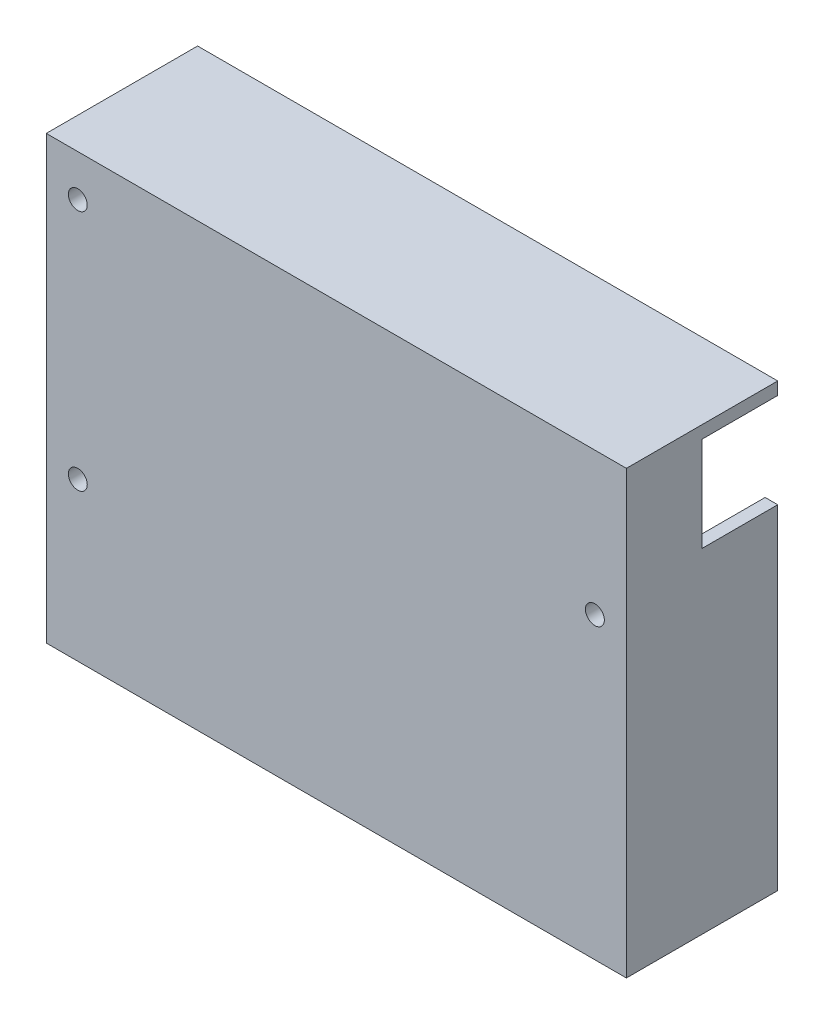
ISO-10303-21;
HEADER;
FILE_DESCRIPTION(('STEP AP214'),'2;1');
FILE_NAME('part.step','',(''),(''),'','','');
FILE_SCHEMA(('AUTOMOTIVE_DESIGN { 1 0 10303 214 1 1 1 1 }'));
ENDSEC;
DATA;
#1=APPLICATION_CONTEXT('core data for automotive mechanical design processes');
#2=APPLICATION_PROTOCOL_DEFINITION('international standard','automotive_design',2000,#1);
#3=PRODUCT_CONTEXT('',#1,'mechanical');
#4=PRODUCT('Part','Part','',(#3));
#5=PRODUCT_RELATED_PRODUCT_CATEGORY('part','',(#4));
#6=PRODUCT_DEFINITION_FORMATION('','',#4);
#7=PRODUCT_DEFINITION_CONTEXT('part definition',#1,'design');
#8=PRODUCT_DEFINITION('design','',#6,#7);
#9=PRODUCT_DEFINITION_SHAPE('','',#8);
#10=(LENGTH_UNIT() NAMED_UNIT(*) SI_UNIT(.MILLI.,.METRE.));
#11=(NAMED_UNIT(*) PLANE_ANGLE_UNIT() SI_UNIT($,.RADIAN.));
#12=(NAMED_UNIT(*) SI_UNIT($,.STERADIAN.) SOLID_ANGLE_UNIT());
#13=UNCERTAINTY_MEASURE_WITH_UNIT(LENGTH_MEASURE(1.E-05),#10,'distance_accuracy_value','');
#14=(GEOMETRIC_REPRESENTATION_CONTEXT(3) GLOBAL_UNCERTAINTY_ASSIGNED_CONTEXT((#13)) GLOBAL_UNIT_ASSIGNED_CONTEXT((#10,
#11,#12)) REPRESENTATION_CONTEXT('',''));
#15=CARTESIAN_POINT('',(0.,0.,0.));
#16=DIRECTION('',(0.,0.,1.));
#17=DIRECTION('',(1.,0.,0.));
#18=AXIS2_PLACEMENT_3D('',#15,#16,#17);
#19=CARTESIAN_POINT('',(0.,0.,0.));
#20=DIRECTION('',(0.,0.,1.));
#21=DIRECTION('',(1.,0.,0.));
#22=AXIS2_PLACEMENT_3D('',#19,#20,#21);
#23=PLANE('',#22);
#24=DIRECTION('',(-1.,0.,0.));
#25=VECTOR('',#24,1.);
#26=CARTESIAN_POINT('',(-3.47487896627011,-39.37,0.));
#27=LINE('',#26,#25);
#28=CARTESIAN_POINT('',(-3.47487896627011,-39.37,0.));
#29=VERTEX_POINT('',#28);
#30=CARTESIAN_POINT('',(-55.8876367075108,-39.37,0.));
#31=VERTEX_POINT('',#30);
#32=EDGE_CURVE('E227',#29,#31,#27,.T.);
#33=ORIENTED_EDGE('',*,*,#32,.F.);
#34=DIRECTION('',(0.,-1.,0.));
#35=VECTOR('',#34,1.);
#36=CARTESIAN_POINT('',(-3.47487896627011,-39.37,0.));
#37=LINE('',#36,#35);
#38=CARTESIAN_POINT('',(-3.47487896627011,-22.3454022414313,0.));
#39=VERTEX_POINT('',#38);
#40=EDGE_CURVE('E51',#39,#29,#37,.T.);
#41=ORIENTED_EDGE('',*,*,#40,.F.);
#42=DIRECTION('',(1.,0.,0.));
#43=VECTOR('',#42,1.);
#44=CARTESIAN_POINT('',(-3.47487896627011,-22.3454022414313,0.));
#45=LINE('',#44,#43);
#46=CARTESIAN_POINT('',(-55.8876367075108,-22.3454022414313,0.));
#47=VERTEX_POINT('',#46);
#48=EDGE_CURVE('E218',#47,#39,#45,.T.);
#49=ORIENTED_EDGE('',*,*,#48,.F.);
#50=DIRECTION('',(0.,1.,0.));
#51=VECTOR('',#50,1.);
#52=CARTESIAN_POINT('',(-55.8876367075108,-39.37,0.));
#53=LINE('',#52,#51);
#54=EDGE_CURVE('E221',#31,#47,#53,.T.);
#55=ORIENTED_EDGE('',*,*,#54,.F.);
#56=EDGE_LOOP('',(#33,#41,#49,#55));
#57=FACE_BOUND('',#56,.T.);
#58=CARTESIAN_POINT('',(2.413,-23.8506,0.));
#59=DIRECTION('',(0.,0.,-1.));
#60=DIRECTION('',(-1.,0.,0.));
#61=AXIS2_PLACEMENT_3D('',#58,#59,#60);
#62=CIRCLE('',#61,1.905);
#63=CARTESIAN_POINT('',(0.508000000000001,-23.8506,0.));
#64=VERTEX_POINT('',#63);
#65=EDGE_CURVE('E233',#64,#64,#62,.T.);
#66=ORIENTED_EDGE('',*,*,#65,.F.);
#67=EDGE_LOOP('',(#66));
#68=FACE_BOUND('',#67,.T.);
#69=CARTESIAN_POINT('',(52.451,-23.8506,0.));
#70=DIRECTION('',(0.,0.,-1.));
#71=DIRECTION('',(-1.,0.,0.));
#72=AXIS2_PLACEMENT_3D('',#69,#70,#71);
#73=CIRCLE('',#72,1.90499999999999);
#74=CARTESIAN_POINT('',(50.546,-23.8506,0.));
#75=VERTEX_POINT('',#74);
#76=EDGE_CURVE('E240',#75,#75,#73,.T.);
#77=ORIENTED_EDGE('',*,*,#76,.F.);
#78=EDGE_LOOP('',(#77));
#79=FACE_BOUND('',#78,.T.);
#80=DIRECTION('',(0.,1.,0.));
#81=VECTOR('',#80,1.);
#82=CARTESIAN_POINT('',(55.88,41.91,0.));
#83=LINE('',#82,#81);
#84=CARTESIAN_POINT('',(55.88,-19.05,0.));
#85=VERTEX_POINT('',#84);
#86=CARTESIAN_POINT('',(55.8799999999999,22.86,0.));
#87=VERTEX_POINT('',#86);
#88=EDGE_CURVE('E311',#85,#87,#83,.T.);
#89=ORIENTED_EDGE('',*,*,#88,.T.);
#90=DIRECTION('',(-1.,0.,0.));
#91=VECTOR('',#90,1.);
#92=CARTESIAN_POINT('',(55.8799999999999,22.86,0.));
#93=LINE('',#92,#91);
#94=CARTESIAN_POINT('',(58.42,22.86,0.));
#95=VERTEX_POINT('',#94);
#96=EDGE_CURVE('E261',#95,#87,#93,.T.);
#97=ORIENTED_EDGE('',*,*,#96,.F.);
#98=DIRECTION('',(0.,1.,0.));
#99=VECTOR('',#98,1.);
#100=CARTESIAN_POINT('',(58.42,44.45,0.));
#101=LINE('',#100,#99);
#102=CARTESIAN_POINT('',(58.42,-44.45,0.));
#103=VERTEX_POINT('',#102);
#104=EDGE_CURVE('E373',#103,#95,#101,.T.);
#105=ORIENTED_EDGE('',*,*,#104,.F.);
#106=DIRECTION('',(1.,0.,0.));
#107=VECTOR('',#106,1.);
#108=CARTESIAN_POINT('',(-58.42,-44.45,0.));
#109=LINE('',#108,#107);
#110=CARTESIAN_POINT('',(-58.42,-44.45,0.));
#111=VERTEX_POINT('',#110);
#112=EDGE_CURVE('E366',#111,#103,#109,.T.);
#113=ORIENTED_EDGE('',*,*,#112,.F.);
#114=DIRECTION('',(0.,-1.,0.));
#115=VECTOR('',#114,1.);
#116=CARTESIAN_POINT('',(-58.42,44.45,0.));
#117=LINE('',#116,#115);
#118=CARTESIAN_POINT('',(-58.42,-6.34999999999999,0.));
#119=VERTEX_POINT('',#118);
#120=EDGE_CURVE('E378',#119,#111,#117,.T.);
#121=ORIENTED_EDGE('',*,*,#120,.F.);
#122=DIRECTION('',(-1.,0.,0.));
#123=VECTOR('',#122,1.);
#124=CARTESIAN_POINT('',(-55.88,-6.34999999999999,0.));
#125=LINE('',#124,#123);
#126=CARTESIAN_POINT('',(-55.88,-6.34999999999999,0.));
#127=VERTEX_POINT('',#126);
#128=EDGE_CURVE('E273',#127,#119,#125,.T.);
#129=ORIENTED_EDGE('',*,*,#128,.F.);
#130=DIRECTION('',(0.,-1.,0.));
#131=VECTOR('',#130,1.);
#132=CARTESIAN_POINT('',(-55.88,41.91,0.));
#133=LINE('',#132,#131);
#134=CARTESIAN_POINT('',(-55.88,-19.05,0.));
#135=VERTEX_POINT('',#134);
#136=EDGE_CURVE('E301',#127,#135,#133,.T.);
#137=ORIENTED_EDGE('',*,*,#136,.T.);
#138=DIRECTION('',(-1.,0.,0.));
#139=VECTOR('',#138,1.);
#140=CARTESIAN_POINT('',(0.,-19.05,0.));
#141=LINE('',#140,#139);
#142=CARTESIAN_POINT('',(8.382,-19.05,0.));
#143=VERTEX_POINT('',#142);
#144=EDGE_CURVE('E396',#143,#135,#141,.T.);
#145=ORIENTED_EDGE('',*,*,#144,.F.);
#146=DIRECTION('',(0.,1.,0.));
#147=VECTOR('',#146,1.);
#148=CARTESIAN_POINT('',(8.38199999999999,-8.89,0.));
#149=LINE('',#148,#147);
#150=CARTESIAN_POINT('',(8.38199999999999,-39.37,0.));
#151=VERTEX_POINT('',#150);
#152=EDGE_CURVE('E324',#151,#143,#149,.T.);
#153=ORIENTED_EDGE('',*,*,#152,.F.);
#154=DIRECTION('',(-1.,0.,0.));
#155=VECTOR('',#154,1.);
#156=CARTESIAN_POINT('',(46.482,-39.37,0.));
#157=LINE('',#156,#155);
#158=CARTESIAN_POINT('',(46.482,-39.37,0.));
#159=VERTEX_POINT('',#158);
#160=EDGE_CURVE('E335',#159,#151,#157,.T.);
#161=ORIENTED_EDGE('',*,*,#160,.F.);
#162=DIRECTION('',(0.,-1.,0.));
#163=VECTOR('',#162,1.);
#164=CARTESIAN_POINT('',(46.482,-8.89,0.));
#165=LINE('',#164,#163);
#166=CARTESIAN_POINT('',(46.482,-19.05,0.));
#167=VERTEX_POINT('',#166);
#168=EDGE_CURVE('E319',#167,#159,#165,.T.);
#169=ORIENTED_EDGE('',*,*,#168,.F.);
#170=EDGE_CURVE('E397',#85,#167,#141,.T.);
#171=ORIENTED_EDGE('',*,*,#170,.F.);
#172=EDGE_LOOP('',(#89,#97,#105,#113,#121,#129,#137,#145,#153,#161,#169,#171));
#173=FACE_BOUND('',#172,.T.);
#174=ADVANCED_FACE('F34',(#57,#68,#79,#173),#23,.F.);
#175=CARTESIAN_POINT('',(-55.88,41.91,0.));
#176=DIRECTION('',(-1.,0.,0.));
#177=DIRECTION('',(0.,-1.,0.));
#178=AXIS2_PLACEMENT_3D('',#175,#176,#177);
#179=PLANE('',#178);
#180=DIRECTION('',(0.,-1.,0.));
#181=VECTOR('',#180,1.);
#182=CARTESIAN_POINT('',(-55.88,41.91,15.24));
#183=LINE('',#182,#181);
#184=CARTESIAN_POINT('',(-55.88,41.91,15.24));
#185=VERTEX_POINT('',#184);
#186=CARTESIAN_POINT('',(-55.88,31.75,15.24));
#187=VERTEX_POINT('',#186);
#188=EDGE_CURVE('E302',#185,#187,#183,.T.);
#189=ORIENTED_EDGE('',*,*,#188,.T.);
#190=DIRECTION('',(0.,0.,-1.));
#191=VECTOR('',#190,1.);
#192=CARTESIAN_POINT('',(-55.88,31.75,15.24));
#193=LINE('',#192,#191);
#194=CARTESIAN_POINT('',(-55.88,31.75,0.));
#195=VERTEX_POINT('',#194);
#196=EDGE_CURVE('E284',#187,#195,#193,.T.);
#197=ORIENTED_EDGE('',*,*,#196,.T.);
#198=CARTESIAN_POINT('',(-55.88,41.91,0.));
#199=VERTEX_POINT('',#198);
#200=EDGE_CURVE('E297',#199,#195,#133,.T.);
#201=ORIENTED_EDGE('',*,*,#200,.F.);
#202=DIRECTION('',(0.,0.,1.));
#203=VECTOR('',#202,1.);
#204=CARTESIAN_POINT('',(-55.88,41.91,0.));
#205=LINE('',#204,#203);
#206=EDGE_CURVE('E307',#199,#185,#205,.T.);
#207=ORIENTED_EDGE('',*,*,#206,.T.);
#208=EDGE_LOOP('',(#189,#197,#201,#207));
#209=FACE_BOUND('',#208,.T.);
#210=ADVANCED_FACE('F493',(#209),#179,.F.);
#211=CARTESIAN_POINT('',(0.,0.,15.24));
#212=DIRECTION('',(0.,0.,1.));
#213=DIRECTION('',(1.,0.,0.));
#214=AXIS2_PLACEMENT_3D('',#211,#212,#213);
#215=PLANE('',#214);
#216=CARTESIAN_POINT('',(52.07,15.748,15.24));
#217=DIRECTION('',(0.,0.,-1.));
#218=DIRECTION('',(-1.,0.,0.));
#219=AXIS2_PLACEMENT_3D('',#216,#217,#218);
#220=CIRCLE('',#219,1.905);
#221=CARTESIAN_POINT('',(50.165,15.748,15.24));
#222=VERTEX_POINT('',#221);
#223=EDGE_CURVE('E246',#222,#222,#220,.T.);
#224=ORIENTED_EDGE('',*,*,#223,.F.);
#225=EDGE_LOOP('',(#224));
#226=FACE_BOUND('',#225,.T.);
#227=CARTESIAN_POINT('',(-52.07,-12.7,15.24));
#228=DIRECTION('',(0.,0.,-1.));
#229=DIRECTION('',(-1.,0.,0.));
#230=AXIS2_PLACEMENT_3D('',#227,#228,#229);
#231=CIRCLE('',#230,1.905);
#232=CARTESIAN_POINT('',(-53.975,-12.7,15.24));
#233=VERTEX_POINT('',#232);
#234=EDGE_CURVE('E251',#233,#233,#231,.T.);
#235=ORIENTED_EDGE('',*,*,#234,.F.);
#236=EDGE_LOOP('',(#235));
#237=FACE_BOUND('',#236,.T.);
#238=CARTESIAN_POINT('',(-52.07,36.068,15.24));
#239=DIRECTION('',(0.,0.,-1.));
#240=DIRECTION('',(-1.,0.,0.));
#241=AXIS2_PLACEMENT_3D('',#238,#239,#240);
#242=CIRCLE('',#241,1.905);
#243=CARTESIAN_POINT('',(-53.975,36.068,15.24));
#244=VERTEX_POINT('',#243);
#245=EDGE_CURVE('E255',#244,#244,#242,.T.);
#246=ORIENTED_EDGE('',*,*,#245,.F.);
#247=EDGE_LOOP('',(#246));
#248=FACE_BOUND('',#247,.T.);
#249=ORIENTED_EDGE('',*,*,#188,.F.);
#250=DIRECTION('',(-1.,0.,0.));
#251=VECTOR('',#250,1.);
#252=CARTESIAN_POINT('',(-60.96,41.91,15.24));
#253=LINE('',#252,#251);
#254=CARTESIAN_POINT('',(58.42,41.91,15.24));
#255=VERTEX_POINT('',#254);
#256=EDGE_CURVE('E358',#255,#185,#253,.T.);
#257=ORIENTED_EDGE('',*,*,#256,.F.);
#258=DIRECTION('',(0.,1.,0.));
#259=VECTOR('',#258,1.);
#260=CARTESIAN_POINT('',(58.42,44.45,15.24));
#261=LINE('',#260,#259);
#262=CARTESIAN_POINT('',(58.42,22.86,15.24));
#263=VERTEX_POINT('',#262);
#264=EDGE_CURVE('E264',#263,#255,#261,.T.);
#265=ORIENTED_EDGE('',*,*,#264,.F.);
#266=DIRECTION('',(-1.,0.,0.));
#267=VECTOR('',#266,1.);
#268=CARTESIAN_POINT('',(55.8799999999999,22.86,15.24));
#269=LINE('',#268,#267);
#270=CARTESIAN_POINT('',(55.88,22.86,15.24));
#271=VERTEX_POINT('',#270);
#272=EDGE_CURVE('E259',#263,#271,#269,.T.);
#273=ORIENTED_EDGE('',*,*,#272,.T.);
#274=DIRECTION('',(0.,1.,0.));
#275=VECTOR('',#274,1.);
#276=CARTESIAN_POINT('',(55.88,41.91,15.24));
#277=LINE('',#276,#275);
#278=CARTESIAN_POINT('',(55.8799999999999,-19.05,15.24));
#279=VERTEX_POINT('',#278);
#280=EDGE_CURVE('E310',#279,#271,#277,.T.);
#281=ORIENTED_EDGE('',*,*,#280,.F.);
#282=DIRECTION('',(1.,0.,0.));
#283=VECTOR('',#282,1.);
#284=CARTESIAN_POINT('',(-60.96,-19.05,15.24));
#285=LINE('',#284,#283);
#286=CARTESIAN_POINT('',(46.482,-19.05,15.24));
#287=VERTEX_POINT('',#286);
#288=EDGE_CURVE('E355',#287,#279,#285,.T.);
#289=ORIENTED_EDGE('',*,*,#288,.F.);
#290=DIRECTION('',(0.,1.,0.));
#291=VECTOR('',#290,1.);
#292=CARTESIAN_POINT('',(46.482,0.,15.24));
#293=LINE('',#292,#291);
#294=CARTESIAN_POINT('',(46.482,-8.89,15.24));
#295=VERTEX_POINT('',#294);
#296=EDGE_CURVE('E352',#287,#295,#293,.T.);
#297=ORIENTED_EDGE('',*,*,#296,.T.);
#298=DIRECTION('',(-1.,0.,0.));
#299=VECTOR('',#298,1.);
#300=CARTESIAN_POINT('',(0.,-8.89,15.24));
#301=LINE('',#300,#299);
#302=CARTESIAN_POINT('',(8.38199999999999,-8.89,15.24));
#303=VERTEX_POINT('',#302);
#304=EDGE_CURVE('E11',#295,#303,#301,.T.);
#305=ORIENTED_EDGE('',*,*,#304,.T.);
#306=DIRECTION('',(0.,-1.,0.));
#307=VECTOR('',#306,1.);
#308=CARTESIAN_POINT('',(8.38199999999999,0.,15.24));
#309=LINE('',#308,#307);
#310=CARTESIAN_POINT('',(8.382,-19.05,15.24));
#311=VERTEX_POINT('',#310);
#312=EDGE_CURVE('E342',#303,#311,#309,.T.);
#313=ORIENTED_EDGE('',*,*,#312,.T.);
#314=CARTESIAN_POINT('',(-55.88,-19.05,15.24));
#315=VERTEX_POINT('',#314);
#316=EDGE_CURVE('E356',#315,#311,#285,.T.);
#317=ORIENTED_EDGE('',*,*,#316,.F.);
#318=CARTESIAN_POINT('',(-55.88,-6.34999999999999,15.24));
#319=VERTEX_POINT('',#318);
#320=EDGE_CURVE('E296',#319,#315,#183,.T.);
#321=ORIENTED_EDGE('',*,*,#320,.F.);
#322=DIRECTION('',(-1.,0.,0.));
#323=VECTOR('',#322,1.);
#324=CARTESIAN_POINT('',(-55.88,-6.34999999999999,15.24));
#325=LINE('',#324,#323);
#326=CARTESIAN_POINT('',(-58.42,-6.34999999999999,15.24));
#327=VERTEX_POINT('',#326);
#328=EDGE_CURVE('E274',#319,#327,#325,.T.);
#329=ORIENTED_EDGE('',*,*,#328,.T.);
#330=DIRECTION('',(0.,1.,0.));
#331=VECTOR('',#330,1.);
#332=CARTESIAN_POINT('',(-58.42,44.45,15.24));
#333=LINE('',#332,#331);
#334=CARTESIAN_POINT('',(-58.42,31.75,15.24));
#335=VERTEX_POINT('',#334);
#336=EDGE_CURVE('E287',#327,#335,#333,.T.);
#337=ORIENTED_EDGE('',*,*,#336,.T.);
#338=DIRECTION('',(1.,0.,0.));
#339=VECTOR('',#338,1.);
#340=CARTESIAN_POINT('',(-55.88,31.75,15.24));
#341=LINE('',#340,#339);
#342=EDGE_CURVE('E277',#335,#187,#341,.T.);
#343=ORIENTED_EDGE('',*,*,#342,.T.);
#344=EDGE_LOOP('',(#249,#257,#265,#273,#281,#289,#297,#305,#313,#317,#321,#329,#337,#343));
#345=FACE_BOUND('',#344,.T.);
#346=ADVANCED_FACE('F449',(#226,#237,#248,#345),#215,.F.);
#347=CARTESIAN_POINT('',(-60.96,41.91,15.24));
#348=DIRECTION('',(0.,-1.,0.));
#349=DIRECTION('',(0.,0.,-1.));
#350=AXIS2_PLACEMENT_3D('',#347,#348,#349);
#351=PLANE('',#350);
#352=ORIENTED_EDGE('',*,*,#256,.T.);
#353=ORIENTED_EDGE('',*,*,#206,.F.);
#354=DIRECTION('',(1.,0.,0.));
#355=VECTOR('',#354,1.);
#356=CARTESIAN_POINT('',(0.,41.91,0.));
#357=LINE('',#356,#355);
#358=CARTESIAN_POINT('',(58.42,41.91,0.));
#359=VERTEX_POINT('',#358);
#360=EDGE_CURVE('E394',#199,#359,#357,.T.);
#361=ORIENTED_EDGE('',*,*,#360,.T.);
#362=DIRECTION('',(0.,0.,-1.));
#363=VECTOR('',#362,1.);
#364=CARTESIAN_POINT('',(58.42,41.91,30.48));
#365=LINE('',#364,#363);
#366=EDGE_CURVE('E267',#255,#359,#365,.T.);
#367=ORIENTED_EDGE('',*,*,#366,.F.);
#368=EDGE_LOOP('',(#352,#353,#361,#367));
#369=FACE_BOUND('',#368,.T.);
#370=ADVANCED_FACE('F496',(#369),#351,.T.);
#371=CARTESIAN_POINT('',(-60.96,-19.05,15.24));
#372=DIRECTION('',(0.,1.,0.));
#373=DIRECTION('',(0.,0.,1.));
#374=AXIS2_PLACEMENT_3D('',#371,#372,#373);
#375=PLANE('',#374);
#376=ORIENTED_EDGE('',*,*,#144,.T.);
#377=DIRECTION('',(0.,0.,1.));
#378=VECTOR('',#377,1.);
#379=CARTESIAN_POINT('',(-55.88,-19.05,0.));
#380=LINE('',#379,#378);
#381=EDGE_CURVE('E300',#135,#315,#380,.T.);
#382=ORIENTED_EDGE('',*,*,#381,.T.);
#383=ORIENTED_EDGE('',*,*,#316,.T.);
#384=DIRECTION('',(0.,0.,1.));
#385=VECTOR('',#384,1.);
#386=CARTESIAN_POINT('',(8.382,-19.05,15.24));
#387=LINE('',#386,#385);
#388=EDGE_CURVE('E399',#143,#311,#387,.T.);
#389=ORIENTED_EDGE('',*,*,#388,.F.);
#390=EDGE_LOOP('',(#376,#382,#383,#389));
#391=FACE_BOUND('',#390,.T.);
#392=ADVANCED_FACE('F475',(#391),#375,.T.);
#393=ORIENTED_EDGE('',*,*,#288,.T.);
#394=DIRECTION('',(0.,0.,1.));
#395=VECTOR('',#394,1.);
#396=CARTESIAN_POINT('',(55.88,-19.05,0.));
#397=LINE('',#396,#395);
#398=EDGE_CURVE('E314',#85,#279,#397,.T.);
#399=ORIENTED_EDGE('',*,*,#398,.F.);
#400=ORIENTED_EDGE('',*,*,#170,.T.);
#401=DIRECTION('',(0.,0.,-1.));
#402=VECTOR('',#401,1.);
#403=CARTESIAN_POINT('',(46.482,-19.05,15.24));
#404=LINE('',#403,#402);
#405=EDGE_CURVE('E43',#287,#167,#404,.T.);
#406=ORIENTED_EDGE('',*,*,#405,.F.);
#407=EDGE_LOOP('',(#393,#399,#400,#406));
#408=FACE_BOUND('',#407,.T.);
#409=ADVANCED_FACE('F452',(#408),#375,.T.);
#410=CARTESIAN_POINT('',(58.42,44.45,30.48));
#411=DIRECTION('',(-1.,0.,0.));
#412=DIRECTION('',(0.,-1.,0.));
#413=AXIS2_PLACEMENT_3D('',#410,#411,#412);
#414=PLANE('',#413);
#415=ORIENTED_EDGE('',*,*,#104,.T.);
#416=DIRECTION('',(0.,0.,1.));
#417=VECTOR('',#416,1.);
#418=CARTESIAN_POINT('',(58.42,22.86,30.48));
#419=LINE('',#418,#417);
#420=EDGE_CURVE('E270',#95,#263,#419,.T.);
#421=ORIENTED_EDGE('',*,*,#420,.T.);
#422=ORIENTED_EDGE('',*,*,#264,.T.);
#423=ORIENTED_EDGE('',*,*,#366,.T.);
#424=CARTESIAN_POINT('',(58.42,44.45,0.));
#425=VERTEX_POINT('',#424);
#426=EDGE_CURVE('E361',#359,#425,#101,.T.);
#427=ORIENTED_EDGE('',*,*,#426,.T.);
#428=DIRECTION('',(0.,0.,-1.));
#429=VECTOR('',#428,1.);
#430=CARTESIAN_POINT('',(58.42,44.45,30.48));
#431=LINE('',#430,#429);
#432=CARTESIAN_POINT('',(58.42,44.45,30.48));
#433=VERTEX_POINT('',#432);
#434=EDGE_CURVE('E391',#433,#425,#431,.T.);
#435=ORIENTED_EDGE('',*,*,#434,.F.);
#436=DIRECTION('',(0.,1.,0.));
#437=VECTOR('',#436,1.);
#438=CARTESIAN_POINT('',(58.42,44.45,30.48));
#439=LINE('',#438,#437);
#440=CARTESIAN_POINT('',(58.42,-44.45,30.48));
#441=VERTEX_POINT('',#440);
#442=EDGE_CURVE('E362',#441,#433,#439,.T.);
#443=ORIENTED_EDGE('',*,*,#442,.F.);
#444=DIRECTION('',(0.,0.,-1.));
#445=VECTOR('',#444,1.);
#446=CARTESIAN_POINT('',(58.42,-44.45,30.48));
#447=LINE('',#446,#445);
#448=EDGE_CURVE('E372',#441,#103,#447,.T.);
#449=ORIENTED_EDGE('',*,*,#448,.T.);
#450=EDGE_LOOP('',(#415,#421,#422,#423,#427,#435,#443,#449));
#451=FACE_BOUND('',#450,.T.);
#452=ADVANCED_FACE('F36',(#451),#414,.F.);
#453=CARTESIAN_POINT('',(-58.42,44.45,30.48));
#454=DIRECTION('',(1.,0.,0.));
#455=DIRECTION('',(0.,1.,0.));
#456=AXIS2_PLACEMENT_3D('',#453,#454,#455);
#457=PLANE('',#456);
#458=CARTESIAN_POINT('',(-58.42,44.45,0.));
#459=VERTEX_POINT('',#458);
#460=CARTESIAN_POINT('',(-58.42,31.75,0.));
#461=VERTEX_POINT('',#460);
#462=EDGE_CURVE('E379',#459,#461,#117,.T.);
#463=ORIENTED_EDGE('',*,*,#462,.T.);
#464=DIRECTION('',(0.,0.,1.));
#465=VECTOR('',#464,1.);
#466=CARTESIAN_POINT('',(-58.42,31.75,30.48));
#467=LINE('',#466,#465);
#468=EDGE_CURVE('E293',#461,#335,#467,.T.);
#469=ORIENTED_EDGE('',*,*,#468,.T.);
#470=ORIENTED_EDGE('',*,*,#336,.F.);
#471=DIRECTION('',(0.,0.,-1.));
#472=VECTOR('',#471,1.);
#473=CARTESIAN_POINT('',(-58.42,-6.34999999999999,30.48));
#474=LINE('',#473,#472);
#475=EDGE_CURVE('E290',#327,#119,#474,.T.);
#476=ORIENTED_EDGE('',*,*,#475,.T.);
#477=ORIENTED_EDGE('',*,*,#120,.T.);
#478=DIRECTION('',(0.,0.,-1.));
#479=VECTOR('',#478,1.);
#480=CARTESIAN_POINT('',(-58.42,-44.45,30.48));
#481=LINE('',#480,#479);
#482=CARTESIAN_POINT('',(-58.42,-44.45,30.48));
#483=VERTEX_POINT('',#482);
#484=EDGE_CURVE('E385',#483,#111,#481,.T.);
#485=ORIENTED_EDGE('',*,*,#484,.F.);
#486=DIRECTION('',(0.,-1.,0.));
#487=VECTOR('',#486,1.);
#488=CARTESIAN_POINT('',(-58.42,44.45,30.48));
#489=LINE('',#488,#487);
#490=CARTESIAN_POINT('',(-58.42,44.45,30.48));
#491=VERTEX_POINT('',#490);
#492=EDGE_CURVE('E368',#491,#483,#489,.T.);
#493=ORIENTED_EDGE('',*,*,#492,.F.);
#494=DIRECTION('',(0.,0.,-1.));
#495=VECTOR('',#494,1.);
#496=CARTESIAN_POINT('',(-58.42,44.45,30.48));
#497=LINE('',#496,#495);
#498=EDGE_CURVE('E388',#491,#459,#497,.T.);
#499=ORIENTED_EDGE('',*,*,#498,.T.);
#500=EDGE_LOOP('',(#463,#469,#470,#476,#477,#485,#493,#499));
#501=FACE_BOUND('',#500,.T.);
#502=ADVANCED_FACE('F434',(#501),#457,.F.);
#503=ORIENTED_EDGE('',*,*,#426,.F.);
#504=ORIENTED_EDGE('',*,*,#360,.F.);
#505=ORIENTED_EDGE('',*,*,#200,.T.);
#506=DIRECTION('',(1.,0.,0.));
#507=VECTOR('',#506,1.);
#508=CARTESIAN_POINT('',(-55.88,31.75,0.));
#509=LINE('',#508,#507);
#510=EDGE_CURVE('E278',#461,#195,#509,.T.);
#511=ORIENTED_EDGE('',*,*,#510,.F.);
#512=ORIENTED_EDGE('',*,*,#462,.F.);
#513=DIRECTION('',(-1.,0.,0.));
#514=VECTOR('',#513,1.);
#515=CARTESIAN_POINT('',(-58.42,44.45,0.));
#516=LINE('',#515,#514);
#517=EDGE_CURVE('E376',#425,#459,#516,.T.);
#518=ORIENTED_EDGE('',*,*,#517,.F.);
#519=EDGE_LOOP('',(#503,#504,#505,#511,#512,#518));
#520=FACE_BOUND('',#519,.T.);
#521=ADVANCED_FACE('F489',(#520),#23,.F.);
#522=CARTESIAN_POINT('',(-58.42,44.45,30.48));
#523=DIRECTION('',(0.,-1.,0.));
#524=DIRECTION('',(0.,0.,-1.));
#525=AXIS2_PLACEMENT_3D('',#522,#523,#524);
#526=PLANE('',#525);
#527=ORIENTED_EDGE('',*,*,#517,.T.);
#528=ORIENTED_EDGE('',*,*,#498,.F.);
#529=DIRECTION('',(-1.,0.,0.));
#530=VECTOR('',#529,1.);
#531=CARTESIAN_POINT('',(-58.42,44.45,30.48));
#532=LINE('',#531,#530);
#533=EDGE_CURVE('E365',#433,#491,#532,.T.);
#534=ORIENTED_EDGE('',*,*,#533,.F.);
#535=ORIENTED_EDGE('',*,*,#434,.T.);
#536=EDGE_LOOP('',(#527,#528,#534,#535));
#537=FACE_BOUND('',#536,.T.);
#538=ADVANCED_FACE('F429',(#537),#526,.F.);
#539=CARTESIAN_POINT('',(-58.42,-44.45,30.48));
#540=DIRECTION('',(0.,1.,0.));
#541=DIRECTION('',(0.,0.,1.));
#542=AXIS2_PLACEMENT_3D('',#539,#540,#541);
#543=PLANE('',#542);
#544=ORIENTED_EDGE('',*,*,#112,.T.);
#545=ORIENTED_EDGE('',*,*,#448,.F.);
#546=DIRECTION('',(1.,0.,0.));
#547=VECTOR('',#546,1.);
#548=CARTESIAN_POINT('',(-58.42,-44.45,30.48));
#549=LINE('',#548,#547);
#550=EDGE_CURVE('E370',#483,#441,#549,.T.);
#551=ORIENTED_EDGE('',*,*,#550,.F.);
#552=ORIENTED_EDGE('',*,*,#484,.T.);
#553=EDGE_LOOP('',(#544,#545,#551,#552));
#554=FACE_BOUND('',#553,.T.);
#555=ADVANCED_FACE('F415',(#554),#543,.F.);
#556=CARTESIAN_POINT('',(0.,0.,30.48));
#557=DIRECTION('',(0.,0.,1.));
#558=DIRECTION('',(1.,0.,0.));
#559=AXIS2_PLACEMENT_3D('',#556,#557,#558);
#560=PLANE('',#559);
#561=CARTESIAN_POINT('',(52.07,15.748,30.48));
#562=DIRECTION('',(0.,0.,1.));
#563=DIRECTION('',(1.,0.,0.));
#564=AXIS2_PLACEMENT_3D('',#561,#562,#563);
#565=CIRCLE('',#564,1.905);
#566=CARTESIAN_POINT('',(53.975,15.748,30.48));
#567=VERTEX_POINT('',#566);
#568=EDGE_CURVE('E38',#567,#567,#565,.T.);
#569=ORIENTED_EDGE('',*,*,#568,.F.);
#570=EDGE_LOOP('',(#569));
#571=FACE_BOUND('',#570,.T.);
#572=CARTESIAN_POINT('',(-52.07,-12.7,30.48));
#573=DIRECTION('',(0.,0.,1.));
#574=DIRECTION('',(1.,0.,0.));
#575=AXIS2_PLACEMENT_3D('',#572,#573,#574);
#576=CIRCLE('',#575,1.905);
#577=CARTESIAN_POINT('',(-50.165,-12.7,30.48));
#578=VERTEX_POINT('',#577);
#579=EDGE_CURVE('E254',#578,#578,#576,.T.);
#580=ORIENTED_EDGE('',*,*,#579,.F.);
#581=EDGE_LOOP('',(#580));
#582=FACE_BOUND('',#581,.T.);
#583=CARTESIAN_POINT('',(-52.07,36.068,30.48));
#584=DIRECTION('',(0.,0.,1.));
#585=DIRECTION('',(1.,0.,0.));
#586=AXIS2_PLACEMENT_3D('',#583,#584,#585);
#587=CIRCLE('',#586,1.905);
#588=CARTESIAN_POINT('',(-50.165,36.068,30.48));
#589=VERTEX_POINT('',#588);
#590=EDGE_CURVE('E258',#589,#589,#587,.T.);
#591=ORIENTED_EDGE('',*,*,#590,.F.);
#592=EDGE_LOOP('',(#591));
#593=FACE_BOUND('',#592,.T.);
#594=ORIENTED_EDGE('',*,*,#442,.T.);
#595=ORIENTED_EDGE('',*,*,#533,.T.);
#596=ORIENTED_EDGE('',*,*,#492,.T.);
#597=ORIENTED_EDGE('',*,*,#550,.T.);
#598=EDGE_LOOP('',(#594,#595,#596,#597));
#599=FACE_BOUND('',#598,.T.);
#600=ADVANCED_FACE('F411',(#571,#582,#593,#599),#560,.T.);
#601=CARTESIAN_POINT('',(46.482,-8.89,25.4));
#602=DIRECTION('',(0.,1.,0.));
#603=DIRECTION('',(0.,0.,1.));
#604=AXIS2_PLACEMENT_3D('',#601,#602,#603);
#605=PLANE('',#604);
#606=DIRECTION('',(0.,0.,-1.));
#607=VECTOR('',#606,1.);
#608=CARTESIAN_POINT('',(46.482,-8.89,25.4));
#609=LINE('',#608,#607);
#610=CARTESIAN_POINT('',(46.482,-8.89,25.4));
#611=VERTEX_POINT('',#610);
#612=EDGE_CURVE('E339',#611,#295,#609,.T.);
#613=ORIENTED_EDGE('',*,*,#612,.F.);
#614=DIRECTION('',(1.,0.,0.));
#615=VECTOR('',#614,1.);
#616=CARTESIAN_POINT('',(46.482,-8.89,25.4));
#617=LINE('',#616,#615);
#618=CARTESIAN_POINT('',(8.38199999999999,-8.89,25.4));
#619=VERTEX_POINT('',#618);
#620=EDGE_CURVE('E330',#619,#611,#617,.T.);
#621=ORIENTED_EDGE('',*,*,#620,.F.);
#622=DIRECTION('',(0.,0.,-1.));
#623=VECTOR('',#622,1.);
#624=CARTESIAN_POINT('',(8.38199999999999,-8.89,25.4));
#625=LINE('',#624,#623);
#626=EDGE_CURVE('E343',#619,#303,#625,.T.);
#627=ORIENTED_EDGE('',*,*,#626,.T.);
#628=ORIENTED_EDGE('',*,*,#304,.F.);
#629=EDGE_LOOP('',(#613,#621,#627,#628));
#630=FACE_BOUND('',#629,.T.);
#631=ADVANCED_FACE('F414',(#630),#605,.F.);
#632=CARTESIAN_POINT('',(46.482,-8.89,25.4));
#633=DIRECTION('',(1.,0.,0.));
#634=DIRECTION('',(0.,1.,0.));
#635=AXIS2_PLACEMENT_3D('',#632,#633,#634);
#636=PLANE('',#635);
#637=ORIENTED_EDGE('',*,*,#405,.T.);
#638=ORIENTED_EDGE('',*,*,#168,.T.);
#639=DIRECTION('',(0.,0.,-1.));
#640=VECTOR('',#639,1.);
#641=CARTESIAN_POINT('',(46.482,-39.37,25.4));
#642=LINE('',#641,#640);
#643=CARTESIAN_POINT('',(46.482,-39.37,25.4));
#644=VERTEX_POINT('',#643);
#645=EDGE_CURVE('E333',#644,#159,#642,.T.);
#646=ORIENTED_EDGE('',*,*,#645,.F.);
#647=DIRECTION('',(0.,-1.,0.));
#648=VECTOR('',#647,1.);
#649=CARTESIAN_POINT('',(46.482,-8.89,25.4));
#650=LINE('',#649,#648);
#651=EDGE_CURVE('E320',#611,#644,#650,.T.);
#652=ORIENTED_EDGE('',*,*,#651,.F.);
#653=ORIENTED_EDGE('',*,*,#612,.T.);
#654=ORIENTED_EDGE('',*,*,#296,.F.);
#655=EDGE_LOOP('',(#637,#638,#646,#652,#653,#654));
#656=FACE_BOUND('',#655,.T.);
#657=ADVANCED_FACE('F455',(#656),#636,.F.);
#658=CARTESIAN_POINT('',(8.38199999999999,-8.89,25.4));
#659=DIRECTION('',(-1.,0.,0.));
#660=DIRECTION('',(0.,0.,1.));
#661=AXIS2_PLACEMENT_3D('',#658,#659,#660);
#662=PLANE('',#661);
#663=ORIENTED_EDGE('',*,*,#626,.F.);
#664=DIRECTION('',(0.,1.,0.));
#665=VECTOR('',#664,1.);
#666=CARTESIAN_POINT('',(8.38199999999999,-8.89,25.4));
#667=LINE('',#666,#665);
#668=CARTESIAN_POINT('',(8.38199999999999,-39.37,25.4));
#669=VERTEX_POINT('',#668);
#670=EDGE_CURVE('E327',#669,#619,#667,.T.);
#671=ORIENTED_EDGE('',*,*,#670,.F.);
#672=DIRECTION('',(0.,0.,-1.));
#673=VECTOR('',#672,1.);
#674=CARTESIAN_POINT('',(8.38199999999999,-39.37,25.4));
#675=LINE('',#674,#673);
#676=EDGE_CURVE('E346',#669,#151,#675,.T.);
#677=ORIENTED_EDGE('',*,*,#676,.T.);
#678=ORIENTED_EDGE('',*,*,#152,.T.);
#679=ORIENTED_EDGE('',*,*,#388,.T.);
#680=ORIENTED_EDGE('',*,*,#312,.F.);
#681=EDGE_LOOP('',(#663,#671,#677,#678,#679,#680));
#682=FACE_BOUND('',#681,.T.);
#683=ADVANCED_FACE('F471',(#682),#662,.F.);
#684=CARTESIAN_POINT('',(46.482,-39.37,25.4));
#685=DIRECTION('',(0.,-1.,0.));
#686=DIRECTION('',(0.,0.,-1.));
#687=AXIS2_PLACEMENT_3D('',#684,#685,#686);
#688=PLANE('',#687);
#689=ORIENTED_EDGE('',*,*,#160,.T.);
#690=ORIENTED_EDGE('',*,*,#676,.F.);
#691=DIRECTION('',(-1.,0.,0.));
#692=VECTOR('',#691,1.);
#693=CARTESIAN_POINT('',(46.482,-39.37,25.4));
#694=LINE('',#693,#692);
#695=EDGE_CURVE('E323',#644,#669,#694,.T.);
#696=ORIENTED_EDGE('',*,*,#695,.F.);
#697=ORIENTED_EDGE('',*,*,#645,.T.);
#698=EDGE_LOOP('',(#689,#690,#696,#697));
#699=FACE_BOUND('',#698,.T.);
#700=ADVANCED_FACE('F460',(#699),#688,.F.);
#701=CARTESIAN_POINT('',(0.,0.,25.4));
#702=DIRECTION('',(0.,0.,-1.));
#703=DIRECTION('',(-1.,0.,0.));
#704=AXIS2_PLACEMENT_3D('',#701,#702,#703);
#705=PLANE('',#704);
#706=ORIENTED_EDGE('',*,*,#651,.T.);
#707=ORIENTED_EDGE('',*,*,#695,.T.);
#708=ORIENTED_EDGE('',*,*,#670,.T.);
#709=ORIENTED_EDGE('',*,*,#620,.T.);
#710=EDGE_LOOP('',(#706,#707,#708,#709));
#711=FACE_BOUND('',#710,.T.);
#712=ADVANCED_FACE('F466',(#711),#705,.T.);
#713=CARTESIAN_POINT('',(55.88,41.91,0.));
#714=DIRECTION('',(1.,0.,0.));
#715=DIRECTION('',(0.,1.,0.));
#716=AXIS2_PLACEMENT_3D('',#713,#714,#715);
#717=PLANE('',#716);
#718=ORIENTED_EDGE('',*,*,#280,.T.);
#719=DIRECTION('',(0.,0.,-1.));
#720=VECTOR('',#719,1.);
#721=CARTESIAN_POINT('',(55.8799999999999,22.86,15.24));
#722=LINE('',#721,#720);
#723=EDGE_CURVE('E59',#271,#87,#722,.T.);
#724=ORIENTED_EDGE('',*,*,#723,.T.);
#725=ORIENTED_EDGE('',*,*,#88,.F.);
#726=ORIENTED_EDGE('',*,*,#398,.T.);
#727=EDGE_LOOP('',(#718,#724,#725,#726));
#728=FACE_BOUND('',#727,.T.);
#729=ADVANCED_FACE('F445',(#728),#717,.F.);
#730=ORIENTED_EDGE('',*,*,#136,.F.);
#731=DIRECTION('',(0.,0.,-1.));
#732=VECTOR('',#731,1.);
#733=CARTESIAN_POINT('',(-55.88,-6.34999999999999,15.24));
#734=LINE('',#733,#732);
#735=EDGE_CURVE('E281',#319,#127,#734,.T.);
#736=ORIENTED_EDGE('',*,*,#735,.F.);
#737=ORIENTED_EDGE('',*,*,#320,.T.);
#738=ORIENTED_EDGE('',*,*,#381,.F.);
#739=EDGE_LOOP('',(#730,#736,#737,#738));
#740=FACE_BOUND('',#739,.T.);
#741=ADVANCED_FACE('F481',(#740),#179,.F.);
#742=CARTESIAN_POINT('',(-55.88,31.75,15.24));
#743=DIRECTION('',(0.,1.,0.));
#744=DIRECTION('',(0.,0.,1.));
#745=AXIS2_PLACEMENT_3D('',#742,#743,#744);
#746=PLANE('',#745);
#747=ORIENTED_EDGE('',*,*,#510,.T.);
#748=ORIENTED_EDGE('',*,*,#196,.F.);
#749=ORIENTED_EDGE('',*,*,#342,.F.);
#750=ORIENTED_EDGE('',*,*,#468,.F.);
#751=EDGE_LOOP('',(#747,#748,#749,#750));
#752=FACE_BOUND('',#751,.T.);
#753=ADVANCED_FACE('F487',(#752),#746,.F.);
#754=CARTESIAN_POINT('',(-55.88,-6.34999999999999,15.24));
#755=DIRECTION('',(0.,-1.,0.));
#756=DIRECTION('',(0.,0.,-1.));
#757=AXIS2_PLACEMENT_3D('',#754,#755,#756);
#758=PLANE('',#757);
#759=ORIENTED_EDGE('',*,*,#328,.F.);
#760=ORIENTED_EDGE('',*,*,#735,.T.);
#761=ORIENTED_EDGE('',*,*,#128,.T.);
#762=ORIENTED_EDGE('',*,*,#475,.F.);
#763=EDGE_LOOP('',(#759,#760,#761,#762));
#764=FACE_BOUND('',#763,.T.);
#765=ADVANCED_FACE('F584',(#764),#758,.F.);
#766=CARTESIAN_POINT('',(55.8799999999999,22.86,15.24));
#767=DIRECTION('',(0.,-1.,0.));
#768=DIRECTION('',(0.,0.,-1.));
#769=AXIS2_PLACEMENT_3D('',#766,#767,#768);
#770=PLANE('',#769);
#771=ORIENTED_EDGE('',*,*,#96,.T.);
#772=ORIENTED_EDGE('',*,*,#723,.F.);
#773=ORIENTED_EDGE('',*,*,#272,.F.);
#774=ORIENTED_EDGE('',*,*,#420,.F.);
#775=EDGE_LOOP('',(#771,#772,#773,#774));
#776=FACE_BOUND('',#775,.T.);
#777=ADVANCED_FACE('F443',(#776),#770,.F.);
#778=CARTESIAN_POINT('',(-52.07,36.068,63.5));
#779=DIRECTION('',(0.,0.,-1.));
#780=DIRECTION('',(-1.,0.,0.));
#781=AXIS2_PLACEMENT_3D('',#778,#779,#780);
#782=CYLINDRICAL_SURFACE('',#781,1.905);
#783=ORIENTED_EDGE('',*,*,#590,.T.);
#784=EDGE_LOOP('',(#783));
#785=FACE_BOUND('',#784,.T.);
#786=ORIENTED_EDGE('',*,*,#245,.T.);
#787=EDGE_LOOP('',(#786));
#788=FACE_BOUND('',#787,.T.);
#789=ADVANCED_FACE('F596',(#785,#788),#782,.F.);
#790=CARTESIAN_POINT('',(-52.07,-12.7,63.5));
#791=DIRECTION('',(0.,0.,-1.));
#792=DIRECTION('',(-1.,0.,0.));
#793=AXIS2_PLACEMENT_3D('',#790,#791,#792);
#794=CYLINDRICAL_SURFACE('',#793,1.905);
#795=ORIENTED_EDGE('',*,*,#579,.T.);
#796=EDGE_LOOP('',(#795));
#797=FACE_BOUND('',#796,.T.);
#798=ORIENTED_EDGE('',*,*,#234,.T.);
#799=EDGE_LOOP('',(#798));
#800=FACE_BOUND('',#799,.T.);
#801=ADVANCED_FACE('F408',(#797,#800),#794,.F.);
#802=CARTESIAN_POINT('',(52.07,15.748,63.5));
#803=DIRECTION('',(0.,0.,-1.));
#804=DIRECTION('',(-1.,0.,0.));
#805=AXIS2_PLACEMENT_3D('',#802,#803,#804);
#806=CYLINDRICAL_SURFACE('',#805,1.905);
#807=ORIENTED_EDGE('',*,*,#568,.T.);
#808=EDGE_LOOP('',(#807));
#809=FACE_BOUND('',#808,.T.);
#810=ORIENTED_EDGE('',*,*,#223,.T.);
#811=EDGE_LOOP('',(#810));
#812=FACE_BOUND('',#811,.T.);
#813=ADVANCED_FACE('F609',(#809,#812),#806,.F.);
#814=CARTESIAN_POINT('',(52.451,-23.8506,6.85799999999999));
#815=DIRECTION('',(0.,0.,-1.));
#816=DIRECTION('',(-1.,0.,0.));
#817=AXIS2_PLACEMENT_3D('',#814,#815,#816);
#818=CYLINDRICAL_SURFACE('',#817,1.90499999999999);
#819=CARTESIAN_POINT('',(52.451,-23.8506,6.85799999999999));
#820=DIRECTION('',(0.,0.,-1.));
#821=DIRECTION('',(-1.,0.,0.));
#822=AXIS2_PLACEMENT_3D('',#819,#820,#821);
#823=CIRCLE('',#822,1.90499999999999);
#824=CARTESIAN_POINT('',(50.546,-23.8506,6.85799999999999));
#825=VERTEX_POINT('',#824);
#826=EDGE_CURVE('E243',#825,#825,#823,.T.);
#827=ORIENTED_EDGE('',*,*,#826,.F.);
#828=EDGE_LOOP('',(#827));
#829=FACE_BOUND('',#828,.T.);
#830=ORIENTED_EDGE('',*,*,#76,.T.);
#831=EDGE_LOOP('',(#830));
#832=FACE_BOUND('',#831,.T.);
#833=ADVANCED_FACE('F616',(#829,#832),#818,.F.);
#834=CARTESIAN_POINT('',(52.451,-23.8506,6.85799999999999));
#835=DIRECTION('',(0.,0.,-1.));
#836=DIRECTION('',(-1.,0.,0.));
#837=AXIS2_PLACEMENT_3D('',#834,#835,#836);
#838=PLANE('',#837);
#839=ORIENTED_EDGE('',*,*,#826,.T.);
#840=EDGE_LOOP('',(#839));
#841=FACE_BOUND('',#840,.T.);
#842=ADVANCED_FACE('F624',(#841),#838,.T.);
#843=CARTESIAN_POINT('',(2.413,-23.8506,6.85799999999999));
#844=DIRECTION('',(0.,0.,-1.));
#845=DIRECTION('',(-1.,0.,0.));
#846=AXIS2_PLACEMENT_3D('',#843,#844,#845);
#847=CYLINDRICAL_SURFACE('',#846,1.905);
#848=CARTESIAN_POINT('',(2.413,-23.8506,6.85799999999999));
#849=DIRECTION('',(0.,0.,-1.));
#850=DIRECTION('',(-1.,0.,0.));
#851=AXIS2_PLACEMENT_3D('',#848,#849,#850);
#852=CIRCLE('',#851,1.905);
#853=CARTESIAN_POINT('',(0.508000000000001,-23.8506,6.85799999999999));
#854=VERTEX_POINT('',#853);
#855=EDGE_CURVE('E237',#854,#854,#852,.T.);
#856=ORIENTED_EDGE('',*,*,#855,.F.);
#857=EDGE_LOOP('',(#856));
#858=FACE_BOUND('',#857,.T.);
#859=ORIENTED_EDGE('',*,*,#65,.T.);
#860=EDGE_LOOP('',(#859));
#861=FACE_BOUND('',#860,.T.);
#862=ADVANCED_FACE('F632',(#858,#861),#847,.F.);
#863=CARTESIAN_POINT('',(2.413,-23.8506,6.85799999999999));
#864=DIRECTION('',(0.,0.,-1.));
#865=DIRECTION('',(-1.,0.,0.));
#866=AXIS2_PLACEMENT_3D('',#863,#864,#865);
#867=PLANE('',#866);
#868=ORIENTED_EDGE('',*,*,#855,.T.);
#869=EDGE_LOOP('',(#868));
#870=FACE_BOUND('',#869,.T.);
#871=ADVANCED_FACE('F640',(#870),#867,.T.);
#872=CARTESIAN_POINT('',(-3.47487896627011,-39.37,4.23333333333333));
#873=DIRECTION('',(1.,0.,0.));
#874=DIRECTION('',(0.,0.,-1.));
#875=AXIS2_PLACEMENT_3D('',#872,#873,#874);
#876=PLANE('',#875);
#877=ORIENTED_EDGE('',*,*,#40,.T.);
#878=DIRECTION('',(0.,0.,-1.));
#879=VECTOR('',#878,1.);
#880=CARTESIAN_POINT('',(-3.47487896627011,-39.37,4.23333333333333));
#881=LINE('',#880,#879);
#882=CARTESIAN_POINT('',(-3.47487896627011,-39.37,4.23333333333333));
#883=VERTEX_POINT('',#882);
#884=EDGE_CURVE('E196',#883,#29,#881,.T.);
#885=ORIENTED_EDGE('',*,*,#884,.F.);
#886=DIRECTION('',(0.,-1.,0.));
#887=VECTOR('',#886,1.);
#888=CARTESIAN_POINT('',(-3.47487896627011,-39.37,4.23333333333333));
#889=LINE('',#888,#887);
#890=CARTESIAN_POINT('',(-3.47487896627011,-22.3454022414313,4.23333333333333));
#891=VERTEX_POINT('',#890);
#892=EDGE_CURVE('E200',#891,#883,#889,.T.);
#893=ORIENTED_EDGE('',*,*,#892,.F.);
#894=DIRECTION('',(0.,0.,-1.));
#895=VECTOR('',#894,1.);
#896=CARTESIAN_POINT('',(-3.47487896627011,-22.3454022414313,4.23333333333333));
#897=LINE('',#896,#895);
#898=EDGE_CURVE('E231',#891,#39,#897,.T.);
#899=ORIENTED_EDGE('',*,*,#898,.T.);
#900=EDGE_LOOP('',(#877,#885,#893,#899));
#901=FACE_BOUND('',#900,.T.);
#902=ADVANCED_FACE('F198',(#901),#876,.F.);
#903=CARTESIAN_POINT('',(-3.47487896627011,-22.3454022414313,4.23333333333333));
#904=DIRECTION('',(0.,1.,0.));
#905=DIRECTION('',(0.,0.,1.));
#906=AXIS2_PLACEMENT_3D('',#903,#904,#905);
#907=PLANE('',#906);
#908=ORIENTED_EDGE('',*,*,#48,.T.);
#909=ORIENTED_EDGE('',*,*,#898,.F.);
#910=DIRECTION('',(1.,0.,0.));
#911=VECTOR('',#910,1.);
#912=CARTESIAN_POINT('',(-3.47487896627011,-22.3454022414313,4.23333333333333));
#913=LINE('',#912,#911);
#914=CARTESIAN_POINT('',(-55.8876367075108,-22.3454022414313,4.23333333333333));
#915=VERTEX_POINT('',#914);
#916=EDGE_CURVE('E206',#915,#891,#913,.T.);
#917=ORIENTED_EDGE('',*,*,#916,.F.);
#918=DIRECTION('',(0.,0.,-1.));
#919=VECTOR('',#918,1.);
#920=CARTESIAN_POINT('',(-55.8876367075108,-22.3454022414313,4.23333333333333));
#921=LINE('',#920,#919);
#922=EDGE_CURVE('E234',#915,#47,#921,.T.);
#923=ORIENTED_EDGE('',*,*,#922,.T.);
#924=EDGE_LOOP('',(#908,#909,#917,#923));
#925=FACE_BOUND('',#924,.T.);
#926=ADVANCED_FACE('F655',(#925),#907,.F.);
#927=CARTESIAN_POINT('',(-55.8876367075108,-39.37,4.23333333333333));
#928=DIRECTION('',(-1.,0.,0.));
#929=DIRECTION('',(0.,0.,1.));
#930=AXIS2_PLACEMENT_3D('',#927,#928,#929);
#931=PLANE('',#930);
#932=ORIENTED_EDGE('',*,*,#54,.T.);
#933=ORIENTED_EDGE('',*,*,#922,.F.);
#934=DIRECTION('',(0.,1.,0.));
#935=VECTOR('',#934,1.);
#936=CARTESIAN_POINT('',(-55.8876367075108,-39.37,4.23333333333333));
#937=LINE('',#936,#935);
#938=CARTESIAN_POINT('',(-55.8876367075108,-39.37,4.23333333333333));
#939=VERTEX_POINT('',#938);
#940=EDGE_CURVE('E214',#939,#915,#937,.T.);
#941=ORIENTED_EDGE('',*,*,#940,.F.);
#942=DIRECTION('',(0.,0.,-1.));
#943=VECTOR('',#942,1.);
#944=CARTESIAN_POINT('',(-55.8876367075108,-39.37,4.23333333333333));
#945=LINE('',#944,#943);
#946=EDGE_CURVE('E205',#939,#31,#945,.T.);
#947=ORIENTED_EDGE('',*,*,#946,.T.);
#948=EDGE_LOOP('',(#932,#933,#941,#947));
#949=FACE_BOUND('',#948,.T.);
#950=ADVANCED_FACE('F662',(#949),#931,.F.);
#951=CARTESIAN_POINT('',(-3.47487896627011,-39.37,4.23333333333333));
#952=DIRECTION('',(0.,-1.,0.));
#953=DIRECTION('',(0.,0.,-1.));
#954=AXIS2_PLACEMENT_3D('',#951,#952,#953);
#955=PLANE('',#954);
#956=ORIENTED_EDGE('',*,*,#32,.T.);
#957=ORIENTED_EDGE('',*,*,#946,.F.);
#958=DIRECTION('',(-1.,0.,0.));
#959=VECTOR('',#958,1.);
#960=CARTESIAN_POINT('',(-3.47487896627011,-39.37,4.23333333333333));
#961=LINE('',#960,#959);
#962=EDGE_CURVE('E209',#883,#939,#961,.T.);
#963=ORIENTED_EDGE('',*,*,#962,.F.);
#964=ORIENTED_EDGE('',*,*,#884,.T.);
#965=EDGE_LOOP('',(#956,#957,#963,#964));
#966=FACE_BOUND('',#965,.T.);
#967=ADVANCED_FACE('F210',(#966),#955,.F.);
#968=CARTESIAN_POINT('',(0.,0.,4.23333333333333));
#969=DIRECTION('',(0.,0.,1.));
#970=DIRECTION('',(1.,0.,0.));
#971=AXIS2_PLACEMENT_3D('',#968,#969,#970);
#972=PLANE('',#971);
#973=ORIENTED_EDGE('',*,*,#892,.T.);
#974=ORIENTED_EDGE('',*,*,#962,.T.);
#975=ORIENTED_EDGE('',*,*,#940,.T.);
#976=ORIENTED_EDGE('',*,*,#916,.T.);
#977=EDGE_LOOP('',(#973,#974,#975,#976));
#978=FACE_BOUND('',#977,.T.);
#979=ADVANCED_FACE('F216',(#978),#972,.F.);
#980=CLOSED_SHELL('',(#174,#210,#346,#370,#392,#409,#452,#502,#521,#538,#555,#600,#631,#657,
#683,#700,#712,#729,#741,#753,#765,#777,#789,#801,#813,#833,#842,#862,#871,#902,#926,#950,#967,#979));
#981=MANIFOLD_SOLID_BREP('B2',#980);
#982=ADVANCED_BREP_SHAPE_REPRESENTATION('',(#18,#981),#14);
#983=SHAPE_DEFINITION_REPRESENTATION(#9,#982);
ENDSEC;
END-ISO-10303-21;
